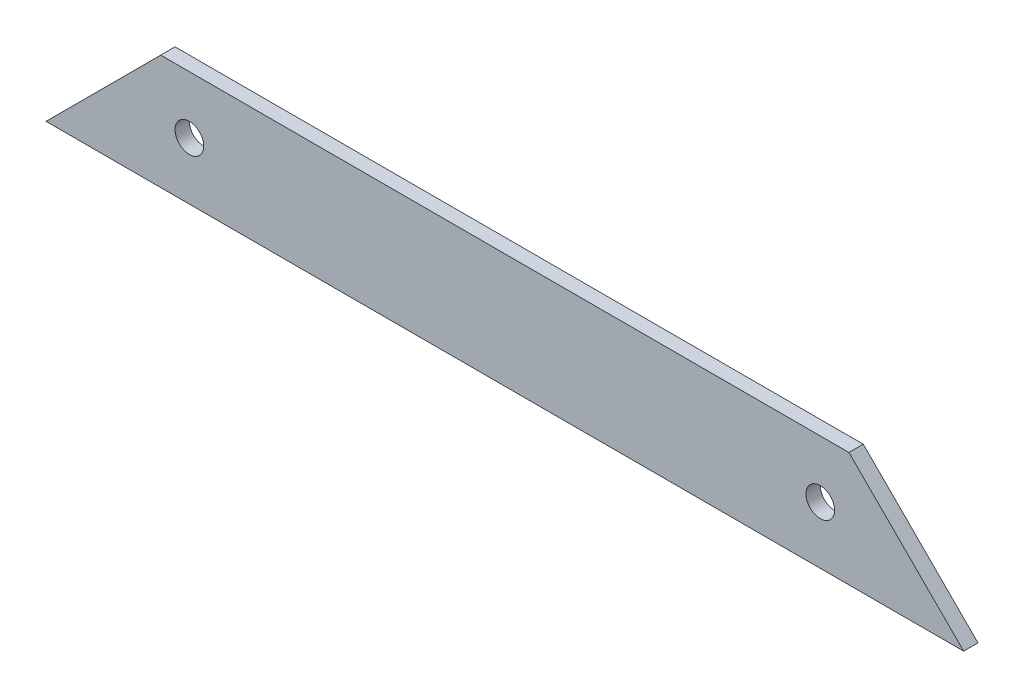
ISO-10303-21;
HEADER;
FILE_DESCRIPTION(('STEP AP214'),'2;1');
FILE_NAME('part.step','',(''),(''),'','','');
FILE_SCHEMA(('AUTOMOTIVE_DESIGN { 1 0 10303 214 1 1 1 1 }'));
ENDSEC;
DATA;
#1=APPLICATION_CONTEXT('core data for automotive mechanical design processes');
#2=APPLICATION_PROTOCOL_DEFINITION('international standard','automotive_design',2000,#1);
#3=PRODUCT_CONTEXT('',#1,'mechanical');
#4=PRODUCT('Part','Part','',(#3));
#5=PRODUCT_RELATED_PRODUCT_CATEGORY('part','',(#4));
#6=PRODUCT_DEFINITION_FORMATION('','',#4);
#7=PRODUCT_DEFINITION_CONTEXT('part definition',#1,'design');
#8=PRODUCT_DEFINITION('design','',#6,#7);
#9=PRODUCT_DEFINITION_SHAPE('','',#8);
#10=(LENGTH_UNIT() NAMED_UNIT(*) SI_UNIT(.MILLI.,.METRE.));
#11=(NAMED_UNIT(*) PLANE_ANGLE_UNIT() SI_UNIT($,.RADIAN.));
#12=(NAMED_UNIT(*) SI_UNIT($,.STERADIAN.) SOLID_ANGLE_UNIT());
#13=UNCERTAINTY_MEASURE_WITH_UNIT(LENGTH_MEASURE(1.E-05),#10,'distance_accuracy_value','');
#14=(GEOMETRIC_REPRESENTATION_CONTEXT(3) GLOBAL_UNCERTAINTY_ASSIGNED_CONTEXT((#13)) GLOBAL_UNIT_ASSIGNED_CONTEXT((#10,
#11,#12)) REPRESENTATION_CONTEXT('',''));
#15=CARTESIAN_POINT('',(0.,0.,0.));
#16=DIRECTION('',(0.,0.,1.));
#17=DIRECTION('',(1.,0.,0.));
#18=AXIS2_PLACEMENT_3D('',#15,#16,#17);
#19=CARTESIAN_POINT('',(0.,0.,3.175));
#20=DIRECTION('',(0.,0.,1.));
#21=DIRECTION('',(1.,0.,0.));
#22=AXIS2_PLACEMENT_3D('',#19,#20,#21);
#23=PLANE('',#22);
#24=CARTESIAN_POINT('',(-69.8500000000003,-12.7,3.175));
#25=DIRECTION('',(0.,0.,1.));
#26=DIRECTION('',(1.,0.,0.));
#27=AXIS2_PLACEMENT_3D('',#24,#25,#26);
#28=CIRCLE('',#27,3.175);
#29=CARTESIAN_POINT('',(-66.6750000000003,-12.7,3.175));
#30=VERTEX_POINT('',#29);
#31=EDGE_CURVE('E100',#30,#30,#28,.T.);
#32=ORIENTED_EDGE('',*,*,#31,.F.);
#33=EDGE_LOOP('',(#32));
#34=FACE_BOUND('',#33,.T.);
#35=DIRECTION('',(-0.707106781186551,-0.707106781186544,0.));
#36=VECTOR('',#35,1.);
#37=CARTESIAN_POINT('',(-76.2,0.,3.175));
#38=LINE('',#37,#36);
#39=CARTESIAN_POINT('',(-76.2,0.,3.175));
#40=VERTEX_POINT('',#39);
#41=CARTESIAN_POINT('',(-101.6,-25.4,3.175));
#42=VERTEX_POINT('',#41);
#43=EDGE_CURVE('E85',#40,#42,#38,.T.);
#44=ORIENTED_EDGE('',*,*,#43,.T.);
#45=DIRECTION('',(1.,0.,0.));
#46=VECTOR('',#45,1.);
#47=CARTESIAN_POINT('',(-101.6,-25.4,3.175));
#48=LINE('',#47,#46);
#49=CARTESIAN_POINT('',(101.6,-25.4,3.175));
#50=VERTEX_POINT('',#49);
#51=EDGE_CURVE('E80',#42,#50,#48,.T.);
#52=ORIENTED_EDGE('',*,*,#51,.T.);
#53=DIRECTION('',(-0.707106781186551,0.707106781186544,0.));
#54=VECTOR('',#53,1.);
#55=CARTESIAN_POINT('',(76.2,0.,3.175));
#56=LINE('',#55,#54);
#57=CARTESIAN_POINT('',(76.2,0.,3.175));
#58=VERTEX_POINT('',#57);
#59=EDGE_CURVE('E83',#50,#58,#56,.T.);
#60=ORIENTED_EDGE('',*,*,#59,.T.);
#61=DIRECTION('',(-1.,0.,0.));
#62=VECTOR('',#61,1.);
#63=CARTESIAN_POINT('',(76.2,0.,3.175));
#64=LINE('',#63,#62);
#65=EDGE_CURVE('E50',#58,#40,#64,.T.);
#66=ORIENTED_EDGE('',*,*,#65,.T.);
#67=EDGE_LOOP('',(#44,#52,#60,#66));
#68=FACE_BOUND('',#67,.T.);
#69=CARTESIAN_POINT('',(69.8500000000003,-12.7,3.175));
#70=DIRECTION('',(0.,0.,1.));
#71=DIRECTION('',(-1.,0.,0.));
#72=AXIS2_PLACEMENT_3D('',#69,#70,#71);
#73=CIRCLE('',#72,3.175);
#74=CARTESIAN_POINT('',(66.6750000000003,-12.7,3.175));
#75=VERTEX_POINT('',#74);
#76=EDGE_CURVE('E115',#75,#75,#73,.T.);
#77=ORIENTED_EDGE('',*,*,#76,.F.);
#78=EDGE_LOOP('',(#77));
#79=FACE_BOUND('',#78,.T.);
#80=ADVANCED_FACE('F33',(#34,#68,#79),#23,.T.);
#81=CARTESIAN_POINT('',(0.,0.,0.));
#82=DIRECTION('',(0.,0.,1.));
#83=DIRECTION('',(1.,0.,0.));
#84=AXIS2_PLACEMENT_3D('',#81,#82,#83);
#85=PLANE('',#84);
#86=CARTESIAN_POINT('',(-69.8500000000003,-12.7,0.));
#87=DIRECTION('',(0.,0.,1.));
#88=DIRECTION('',(1.,0.,0.));
#89=AXIS2_PLACEMENT_3D('',#86,#87,#88);
#90=CIRCLE('',#89,3.175);
#91=CARTESIAN_POINT('',(-66.6750000000003,-12.7,0.));
#92=VERTEX_POINT('',#91);
#93=EDGE_CURVE('E112',#92,#92,#90,.T.);
#94=ORIENTED_EDGE('',*,*,#93,.T.);
#95=EDGE_LOOP('',(#94));
#96=FACE_BOUND('',#95,.T.);
#97=DIRECTION('',(-0.707106781186551,-0.707106781186544,0.));
#98=VECTOR('',#97,1.);
#99=CARTESIAN_POINT('',(-76.2,0.,0.));
#100=LINE('',#99,#98);
#101=CARTESIAN_POINT('',(-76.2,0.,0.));
#102=VERTEX_POINT('',#101);
#103=CARTESIAN_POINT('',(-101.6,-25.4,0.));
#104=VERTEX_POINT('',#103);
#105=EDGE_CURVE('E97',#102,#104,#100,.T.);
#106=ORIENTED_EDGE('',*,*,#105,.F.);
#107=DIRECTION('',(-1.,0.,0.));
#108=VECTOR('',#107,1.);
#109=CARTESIAN_POINT('',(76.2,0.,0.));
#110=LINE('',#109,#108);
#111=CARTESIAN_POINT('',(76.2,0.,0.));
#112=VERTEX_POINT('',#111);
#113=EDGE_CURVE('E73',#112,#102,#110,.T.);
#114=ORIENTED_EDGE('',*,*,#113,.F.);
#115=DIRECTION('',(-0.707106781186551,0.707106781186544,0.));
#116=VECTOR('',#115,1.);
#117=CARTESIAN_POINT('',(76.2,0.,0.));
#118=LINE('',#117,#116);
#119=CARTESIAN_POINT('',(101.6,-25.4,0.));
#120=VERTEX_POINT('',#119);
#121=EDGE_CURVE('E67',#120,#112,#118,.T.);
#122=ORIENTED_EDGE('',*,*,#121,.F.);
#123=DIRECTION('',(1.,0.,0.));
#124=VECTOR('',#123,1.);
#125=CARTESIAN_POINT('',(-101.6,-25.4,0.));
#126=LINE('',#125,#124);
#127=EDGE_CURVE('E89',#104,#120,#126,.T.);
#128=ORIENTED_EDGE('',*,*,#127,.F.);
#129=EDGE_LOOP('',(#106,#114,#122,#128));
#130=FACE_BOUND('',#129,.T.);
#131=CARTESIAN_POINT('',(69.8500000000003,-12.7,0.));
#132=DIRECTION('',(0.,0.,1.));
#133=DIRECTION('',(-1.,0.,0.));
#134=AXIS2_PLACEMENT_3D('',#131,#132,#133);
#135=CIRCLE('',#134,3.175);
#136=CARTESIAN_POINT('',(66.6750000000003,-12.7,0.));
#137=VERTEX_POINT('',#136);
#138=EDGE_CURVE('E118',#137,#137,#135,.T.);
#139=ORIENTED_EDGE('',*,*,#138,.T.);
#140=EDGE_LOOP('',(#139));
#141=FACE_BOUND('',#140,.T.);
#142=ADVANCED_FACE('F108',(#96,#130,#141),#85,.F.);
#143=CARTESIAN_POINT('',(-76.2,0.,3.175));
#144=DIRECTION('',(0.707106781186544,-0.707106781186551,0.));
#145=DIRECTION('',(0.707106781186551,0.707106781186544,0.));
#146=AXIS2_PLACEMENT_3D('',#143,#144,#145);
#147=PLANE('',#146);
#148=ORIENTED_EDGE('',*,*,#105,.T.);
#149=DIRECTION('',(0.,0.,-1.));
#150=VECTOR('',#149,1.);
#151=CARTESIAN_POINT('',(-101.6,-25.4,3.175));
#152=LINE('',#151,#150);
#153=EDGE_CURVE('E11',#42,#104,#152,.T.);
#154=ORIENTED_EDGE('',*,*,#153,.F.);
#155=ORIENTED_EDGE('',*,*,#43,.F.);
#156=DIRECTION('',(0.,0.,-1.));
#157=VECTOR('',#156,1.);
#158=CARTESIAN_POINT('',(-76.2,0.,3.175));
#159=LINE('',#158,#157);
#160=EDGE_CURVE('E93',#40,#102,#159,.T.);
#161=ORIENTED_EDGE('',*,*,#160,.T.);
#162=EDGE_LOOP('',(#148,#154,#155,#161));
#163=FACE_BOUND('',#162,.T.);
#164=ADVANCED_FACE('F35',(#163),#147,.F.);
#165=CARTESIAN_POINT('',(-101.6,-25.4,3.175));
#166=DIRECTION('',(0.,1.,0.));
#167=DIRECTION('',(-1.,0.,0.));
#168=AXIS2_PLACEMENT_3D('',#165,#166,#167);
#169=PLANE('',#168);
#170=ORIENTED_EDGE('',*,*,#127,.T.);
#171=DIRECTION('',(0.,0.,-1.));
#172=VECTOR('',#171,1.);
#173=CARTESIAN_POINT('',(101.6,-25.4,3.175));
#174=LINE('',#173,#172);
#175=EDGE_CURVE('E42',#50,#120,#174,.T.);
#176=ORIENTED_EDGE('',*,*,#175,.F.);
#177=ORIENTED_EDGE('',*,*,#51,.F.);
#178=ORIENTED_EDGE('',*,*,#153,.T.);
#179=EDGE_LOOP('',(#170,#176,#177,#178));
#180=FACE_BOUND('',#179,.T.);
#181=ADVANCED_FACE('F88',(#180),#169,.F.);
#182=CARTESIAN_POINT('',(76.2,0.,3.175));
#183=DIRECTION('',(-0.707106781186544,-0.707106781186551,0.));
#184=DIRECTION('',(0.707106781186551,-0.707106781186544,0.));
#185=AXIS2_PLACEMENT_3D('',#182,#183,#184);
#186=PLANE('',#185);
#187=ORIENTED_EDGE('',*,*,#121,.T.);
#188=DIRECTION('',(0.,0.,-1.));
#189=VECTOR('',#188,1.);
#190=CARTESIAN_POINT('',(76.2,0.,3.175));
#191=LINE('',#190,#189);
#192=EDGE_CURVE('E90',#58,#112,#191,.T.);
#193=ORIENTED_EDGE('',*,*,#192,.F.);
#194=ORIENTED_EDGE('',*,*,#59,.F.);
#195=ORIENTED_EDGE('',*,*,#175,.T.);
#196=EDGE_LOOP('',(#187,#193,#194,#195));
#197=FACE_BOUND('',#196,.T.);
#198=ADVANCED_FACE('F91',(#197),#186,.F.);
#199=CARTESIAN_POINT('',(76.2,0.,3.175));
#200=DIRECTION('',(0.,-1.,0.));
#201=DIRECTION('',(1.,0.,0.));
#202=AXIS2_PLACEMENT_3D('',#199,#200,#201);
#203=PLANE('',#202);
#204=ORIENTED_EDGE('',*,*,#113,.T.);
#205=ORIENTED_EDGE('',*,*,#160,.F.);
#206=ORIENTED_EDGE('',*,*,#65,.F.);
#207=ORIENTED_EDGE('',*,*,#192,.T.);
#208=EDGE_LOOP('',(#204,#205,#206,#207));
#209=FACE_BOUND('',#208,.T.);
#210=ADVANCED_FACE('F105',(#209),#203,.F.);
#211=CARTESIAN_POINT('',(-69.8500000000003,-12.7,3.175));
#212=DIRECTION('',(0.,0.,-1.));
#213=DIRECTION('',(-1.,0.,0.));
#214=AXIS2_PLACEMENT_3D('',#211,#212,#213);
#215=CYLINDRICAL_SURFACE('',#214,3.175);
#216=ORIENTED_EDGE('',*,*,#31,.T.);
#217=EDGE_LOOP('',(#216));
#218=FACE_BOUND('',#217,.T.);
#219=ORIENTED_EDGE('',*,*,#93,.F.);
#220=EDGE_LOOP('',(#219));
#221=FACE_BOUND('',#220,.T.);
#222=ADVANCED_FACE('F136',(#218,#221),#215,.F.);
#223=CARTESIAN_POINT('',(69.8500000000003,-12.7,3.175));
#224=DIRECTION('',(0.,0.,-1.));
#225=DIRECTION('',(-1.,0.,0.));
#226=AXIS2_PLACEMENT_3D('',#223,#224,#225);
#227=CYLINDRICAL_SURFACE('',#226,3.175);
#228=ORIENTED_EDGE('',*,*,#76,.T.);
#229=EDGE_LOOP('',(#228));
#230=FACE_BOUND('',#229,.T.);
#231=ORIENTED_EDGE('',*,*,#138,.F.);
#232=EDGE_LOOP('',(#231));
#233=FACE_BOUND('',#232,.T.);
#234=ADVANCED_FACE('F124',(#230,#233),#227,.F.);
#235=CLOSED_SHELL('',(#80,#142,#164,#181,#198,#210,#222,#234));
#236=MANIFOLD_SOLID_BREP('B2',#235);
#237=ADVANCED_BREP_SHAPE_REPRESENTATION('',(#18,#236),#14);
#238=SHAPE_DEFINITION_REPRESENTATION(#9,#237);
ENDSEC;
END-ISO-10303-21;
